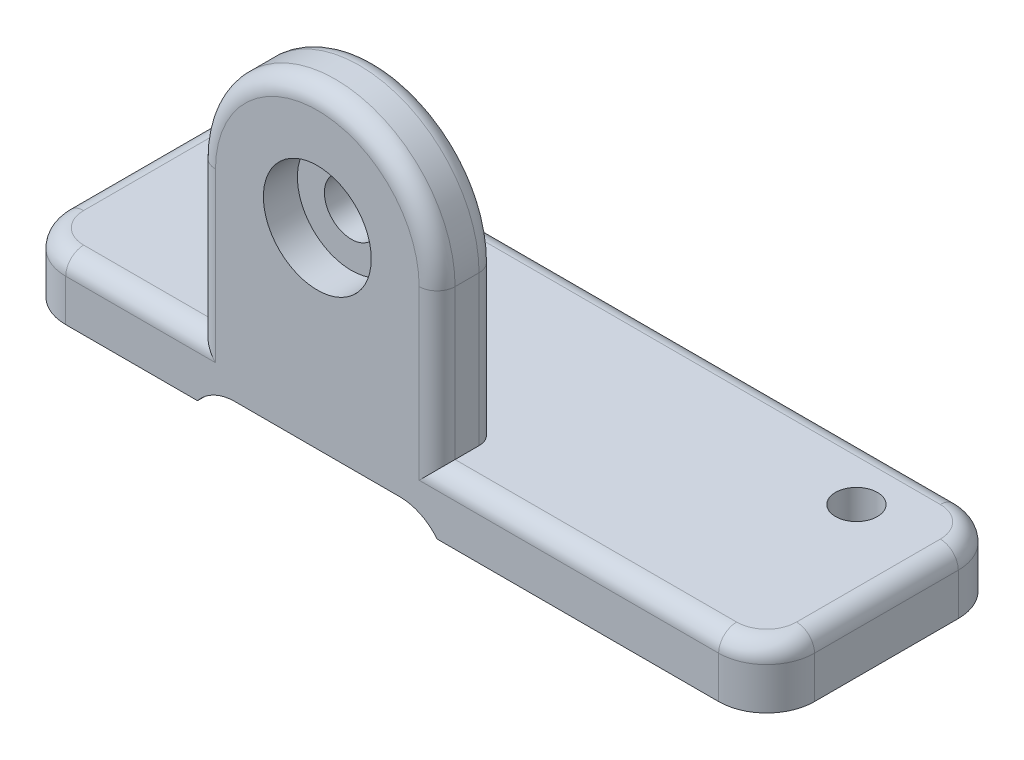
ISO-10303-21;
HEADER;
FILE_DESCRIPTION(('STEP AP214'),'2;1');
FILE_NAME('part.step','',(''),(''),'','','');
FILE_SCHEMA(('AUTOMOTIVE_DESIGN { 1 0 10303 214 1 1 1 1 }'));
ENDSEC;
DATA;
#1=APPLICATION_CONTEXT('core data for automotive mechanical design processes');
#2=APPLICATION_PROTOCOL_DEFINITION('international standard','automotive_design',2000,#1);
#3=PRODUCT_CONTEXT('',#1,'mechanical');
#4=PRODUCT('Part','Part','',(#3));
#5=PRODUCT_RELATED_PRODUCT_CATEGORY('part','',(#4));
#6=PRODUCT_DEFINITION_FORMATION('','',#4);
#7=PRODUCT_DEFINITION_CONTEXT('part definition',#1,'design');
#8=PRODUCT_DEFINITION('design','',#6,#7);
#9=PRODUCT_DEFINITION_SHAPE('','',#8);
#10=(LENGTH_UNIT() NAMED_UNIT(*) SI_UNIT(.MILLI.,.METRE.));
#11=(NAMED_UNIT(*) PLANE_ANGLE_UNIT() SI_UNIT($,.RADIAN.));
#12=(NAMED_UNIT(*) SI_UNIT($,.STERADIAN.) SOLID_ANGLE_UNIT());
#13=UNCERTAINTY_MEASURE_WITH_UNIT(LENGTH_MEASURE(1.E-05),#10,'distance_accuracy_value','');
#14=(GEOMETRIC_REPRESENTATION_CONTEXT(3) GLOBAL_UNCERTAINTY_ASSIGNED_CONTEXT((#13)) GLOBAL_UNIT_ASSIGNED_CONTEXT((#10,
#11,#12)) REPRESENTATION_CONTEXT('',''));
#15=CARTESIAN_POINT('',(0.,0.,0.));
#16=DIRECTION('',(0.,0.,1.));
#17=DIRECTION('',(1.,0.,0.));
#18=AXIS2_PLACEMENT_3D('',#15,#16,#17);
#19=CARTESIAN_POINT('',(0.,0.,0.));
#20=DIRECTION('',(0.,-1.,0.));
#21=DIRECTION('',(0.,0.,-1.));
#22=AXIS2_PLACEMENT_3D('',#19,#20,#21);
#23=PLANE('',#22);
#24=CARTESIAN_POINT('',(15.,0.,-30.));
#25=DIRECTION('',(0.,1.,0.));
#26=DIRECTION('',(0.,0.,1.));
#27=AXIS2_PLACEMENT_3D('',#24,#25,#26);
#28=CIRCLE('',#27,3.5);
#29=CARTESIAN_POINT('',(15.,0.,-26.5));
#30=VERTEX_POINT('',#29);
#31=EDGE_CURVE('E463',#30,#30,#28,.T.);
#32=ORIENTED_EDGE('',*,*,#31,.T.);
#33=EDGE_LOOP('',(#32));
#34=FACE_BOUND('',#33,.T.);
#35=DIRECTION('',(0.,0.,1.));
#36=VECTOR('',#35,1.);
#37=CARTESIAN_POINT('',(0.,0.,0.));
#38=LINE('',#37,#36);
#39=CARTESIAN_POINT('',(0.,0.,-32.));
#40=VERTEX_POINT('',#39);
#41=CARTESIAN_POINT('',(0.,0.,-8.));
#42=VERTEX_POINT('',#41);
#43=EDGE_CURVE('E497',#40,#42,#38,.T.);
#44=ORIENTED_EDGE('',*,*,#43,.F.);
#45=CARTESIAN_POINT('',(8.,0.,-32.));
#46=DIRECTION('',(0.,-1.,0.));
#47=DIRECTION('',(0.,0.,-1.));
#48=AXIS2_PLACEMENT_3D('',#45,#46,#47);
#49=CIRCLE('',#48,8.);
#50=CARTESIAN_POINT('',(8.,0.,-40.));
#51=VERTEX_POINT('',#50);
#52=EDGE_CURVE('E291',#40,#51,#49,.T.);
#53=ORIENTED_EDGE('',*,*,#52,.T.);
#54=DIRECTION('',(-1.,0.,0.));
#55=VECTOR('',#54,1.);
#56=CARTESIAN_POINT('',(0.,0.,-40.));
#57=LINE('',#56,#55);
#58=CARTESIAN_POINT('',(30.,0.,-40.));
#59=VERTEX_POINT('',#58);
#60=EDGE_CURVE('E235',#59,#51,#57,.T.);
#61=ORIENTED_EDGE('',*,*,#60,.F.);
#62=DIRECTION('',(0.,0.,-1.));
#63=VECTOR('',#62,1.);
#64=CARTESIAN_POINT('',(30.,0.,0.));
#65=LINE('',#64,#63);
#66=CARTESIAN_POINT('',(30.,0.,0.));
#67=VERTEX_POINT('',#66);
#68=EDGE_CURVE('E211',#67,#59,#65,.T.);
#69=ORIENTED_EDGE('',*,*,#68,.F.);
#70=DIRECTION('',(1.,0.,0.));
#71=VECTOR('',#70,1.);
#72=CARTESIAN_POINT('',(0.,0.,0.));
#73=LINE('',#72,#71);
#74=CARTESIAN_POINT('',(8.,0.,0.));
#75=VERTEX_POINT('',#74);
#76=EDGE_CURVE('E221',#75,#67,#73,.T.);
#77=ORIENTED_EDGE('',*,*,#76,.F.);
#78=CARTESIAN_POINT('',(8.,0.,-8.));
#79=DIRECTION('',(0.,-1.,0.));
#80=DIRECTION('',(0.,0.,-1.));
#81=AXIS2_PLACEMENT_3D('',#78,#79,#80);
#82=CIRCLE('',#81,8.);
#83=EDGE_CURVE('E288',#75,#42,#82,.T.);
#84=ORIENTED_EDGE('',*,*,#83,.T.);
#85=EDGE_LOOP('',(#44,#53,#61,#69,#77,#84));
#86=FACE_BOUND('',#85,.T.);
#87=ADVANCED_FACE('F41',(#34,#86),#23,.T.);
#88=CARTESIAN_POINT('',(0.,10.,0.));
#89=DIRECTION('',(1.,0.,0.));
#90=DIRECTION('',(0.,0.,-1.));
#91=AXIS2_PLACEMENT_3D('',#88,#89,#90);
#92=PLANE('',#91);
#93=DIRECTION('',(0.,-1.,0.));
#94=VECTOR('',#93,1.);
#95=CARTESIAN_POINT('',(0.,10.,-8.));
#96=LINE('',#95,#94);
#97=CARTESIAN_POINT('',(0.,7.,-8.));
#98=VERTEX_POINT('',#97);
#99=EDGE_CURVE('E281',#42,#98,#96,.F.);
#100=ORIENTED_EDGE('',*,*,#99,.T.);
#101=DIRECTION('',(0.,0.,1.));
#102=VECTOR('',#101,1.);
#103=CARTESIAN_POINT('',(0.,7.,0.));
#104=LINE('',#103,#102);
#105=CARTESIAN_POINT('',(0.,7.,-32.));
#106=VERTEX_POINT('',#105);
#107=EDGE_CURVE('E353',#98,#106,#104,.F.);
#108=ORIENTED_EDGE('',*,*,#107,.T.);
#109=DIRECTION('',(0.,-1.,0.));
#110=VECTOR('',#109,1.);
#111=CARTESIAN_POINT('',(0.,10.,-32.));
#112=LINE('',#111,#110);
#113=EDGE_CURVE('E285',#106,#40,#112,.T.);
#114=ORIENTED_EDGE('',*,*,#113,.T.);
#115=ORIENTED_EDGE('',*,*,#43,.T.);
#116=EDGE_LOOP('',(#100,#108,#114,#115));
#117=FACE_BOUND('',#116,.T.);
#118=ADVANCED_FACE('F602',(#117),#92,.F.);
#119=CARTESIAN_POINT('',(0.,10.,0.));
#120=DIRECTION('',(0.,0.,-1.));
#121=DIRECTION('',(-1.,0.,0.));
#122=AXIS2_PLACEMENT_3D('',#119,#120,#121);
#123=PLANE('',#122);
#124=CARTESIAN_POINT('',(50.,35.,0.));
#125=DIRECTION('',(0.,0.,1.));
#126=DIRECTION('',(1.,0.,0.));
#127=AXIS2_PLACEMENT_3D('',#124,#125,#126);
#128=CIRCLE('',#127,9.005);
#129=CARTESIAN_POINT('',(59.005,35.,0.));
#130=VERTEX_POINT('',#129);
#131=EDGE_CURVE('E444',#130,#130,#128,.T.);
#132=ORIENTED_EDGE('',*,*,#131,.F.);
#133=EDGE_LOOP('',(#132));
#134=FACE_BOUND('',#133,.T.);
#135=DIRECTION('',(0.,-1.,0.));
#136=VECTOR('',#135,1.);
#137=CARTESIAN_POINT('',(33.,10.,0.));
#138=LINE('',#137,#136);
#139=CARTESIAN_POINT('',(33.,35.,0.));
#140=VERTEX_POINT('',#139);
#141=CARTESIAN_POINT('',(33.,7.,0.));
#142=VERTEX_POINT('',#141);
#143=EDGE_CURVE('E344',#140,#142,#138,.T.);
#144=ORIENTED_EDGE('',*,*,#143,.T.);
#145=DIRECTION('',(1.,0.,0.));
#146=VECTOR('',#145,1.);
#147=CARTESIAN_POINT('',(0.,7.,0.));
#148=LINE('',#147,#146);
#149=CARTESIAN_POINT('',(8.,7.,0.));
#150=VERTEX_POINT('',#149);
#151=EDGE_CURVE('E347',#142,#150,#148,.F.);
#152=ORIENTED_EDGE('',*,*,#151,.T.);
#153=DIRECTION('',(0.,-1.,0.));
#154=VECTOR('',#153,1.);
#155=CARTESIAN_POINT('',(8.,10.,0.));
#156=LINE('',#155,#154);
#157=EDGE_CURVE('E225',#150,#75,#156,.T.);
#158=ORIENTED_EDGE('',*,*,#157,.T.);
#159=ORIENTED_EDGE('',*,*,#76,.T.);
#160=CARTESIAN_POINT('',(36.2449979983984,-5.,0.));
#161=DIRECTION('',(0.,0.,-1.));
#162=DIRECTION('',(-1.,0.,0.));
#163=AXIS2_PLACEMENT_3D('',#160,#161,#162);
#164=CIRCLE('',#163,8.);
#165=CARTESIAN_POINT('',(36.2449979983984,3.,0.));
#166=VERTEX_POINT('',#165);
#167=EDGE_CURVE('E206',#67,#166,#164,.T.);
#168=ORIENTED_EDGE('',*,*,#167,.T.);
#169=DIRECTION('',(-1.,0.,0.));
#170=VECTOR('',#169,1.);
#171=CARTESIAN_POINT('',(30.,3.,0.));
#172=LINE('',#171,#170);
#173=CARTESIAN_POINT('',(63.7550020016016,3.,0.));
#174=VERTEX_POINT('',#173);
#175=EDGE_CURVE('E254',#174,#166,#172,.T.);
#176=ORIENTED_EDGE('',*,*,#175,.F.);
#177=CARTESIAN_POINT('',(63.7550020016016,-5.,0.));
#178=DIRECTION('',(0.,0.,-1.));
#179=DIRECTION('',(-1.,0.,0.));
#180=AXIS2_PLACEMENT_3D('',#177,#178,#179);
#181=CIRCLE('',#180,8.);
#182=CARTESIAN_POINT('',(70.,0.,0.));
#183=VERTEX_POINT('',#182);
#184=EDGE_CURVE('E300',#174,#183,#181,.T.);
#185=ORIENTED_EDGE('',*,*,#184,.T.);
#186=CARTESIAN_POINT('',(117.,0.,0.));
#187=VERTEX_POINT('',#186);
#188=EDGE_CURVE('E230',#183,#187,#73,.T.);
#189=ORIENTED_EDGE('',*,*,#188,.T.);
#190=DIRECTION('',(0.,-1.,0.));
#191=VECTOR('',#190,1.);
#192=CARTESIAN_POINT('',(117.,10.,0.));
#193=LINE('',#192,#191);
#194=CARTESIAN_POINT('',(117.,7.,0.));
#195=VERTEX_POINT('',#194);
#196=EDGE_CURVE('E270',#187,#195,#193,.F.);
#197=ORIENTED_EDGE('',*,*,#196,.T.);
#198=DIRECTION('',(1.,0.,0.));
#199=VECTOR('',#198,1.);
#200=CARTESIAN_POINT('',(0.,7.,0.));
#201=LINE('',#200,#199);
#202=CARTESIAN_POINT('',(67.,7.,0.));
#203=VERTEX_POINT('',#202);
#204=EDGE_CURVE('E338',#195,#203,#201,.F.);
#205=ORIENTED_EDGE('',*,*,#204,.T.);
#206=DIRECTION('',(0.,1.,0.));
#207=VECTOR('',#206,1.);
#208=CARTESIAN_POINT('',(67.,35.,0.));
#209=LINE('',#208,#207);
#210=CARTESIAN_POINT('',(67.,35.,0.));
#211=VERTEX_POINT('',#210);
#212=EDGE_CURVE('E335',#203,#211,#209,.T.);
#213=ORIENTED_EDGE('',*,*,#212,.T.);
#214=CARTESIAN_POINT('',(50.,35.,0.));
#215=DIRECTION('',(0.,0.,-1.));
#216=DIRECTION('',(-1.,0.,0.));
#217=AXIS2_PLACEMENT_3D('',#214,#215,#216);
#218=CIRCLE('',#217,17.);
#219=EDGE_CURVE('E341',#211,#140,#218,.F.);
#220=ORIENTED_EDGE('',*,*,#219,.T.);
#221=EDGE_LOOP('',(#144,#152,#158,#159,#168,#176,#185,#189,#197,#205,#213,#220));
#222=FACE_BOUND('',#221,.T.);
#223=ADVANCED_FACE('F222',(#134,#222),#123,.F.);
#224=CARTESIAN_POINT('',(125.,10.,0.));
#225=DIRECTION('',(-1.,0.,0.));
#226=DIRECTION('',(0.,0.,1.));
#227=AXIS2_PLACEMENT_3D('',#224,#225,#226);
#228=PLANE('',#227);
#229=DIRECTION('',(0.,-1.,0.));
#230=VECTOR('',#229,1.);
#231=CARTESIAN_POINT('',(125.,10.,-32.));
#232=LINE('',#231,#230);
#233=CARTESIAN_POINT('',(125.,0.,-32.));
#234=VERTEX_POINT('',#233);
#235=CARTESIAN_POINT('',(125.,7.,-32.));
#236=VERTEX_POINT('',#235);
#237=EDGE_CURVE('E243',#234,#236,#232,.F.);
#238=ORIENTED_EDGE('',*,*,#237,.T.);
#239=DIRECTION('',(0.,0.,-1.));
#240=VECTOR('',#239,1.);
#241=CARTESIAN_POINT('',(125.,7.,0.));
#242=LINE('',#241,#240);
#243=CARTESIAN_POINT('',(125.,7.,-8.));
#244=VERTEX_POINT('',#243);
#245=EDGE_CURVE('E365',#236,#244,#242,.F.);
#246=ORIENTED_EDGE('',*,*,#245,.T.);
#247=DIRECTION('',(0.,-1.,0.));
#248=VECTOR('',#247,1.);
#249=CARTESIAN_POINT('',(125.,10.,-8.));
#250=LINE('',#249,#248);
#251=CARTESIAN_POINT('',(125.,0.,-8.));
#252=VERTEX_POINT('',#251);
#253=EDGE_CURVE('E259',#244,#252,#250,.T.);
#254=ORIENTED_EDGE('',*,*,#253,.T.);
#255=DIRECTION('',(0.,0.,-1.));
#256=VECTOR('',#255,1.);
#257=CARTESIAN_POINT('',(125.,0.,0.));
#258=LINE('',#257,#256);
#259=EDGE_CURVE('E229',#252,#234,#258,.T.);
#260=ORIENTED_EDGE('',*,*,#259,.T.);
#261=EDGE_LOOP('',(#238,#246,#254,#260));
#262=FACE_BOUND('',#261,.T.);
#263=ADVANCED_FACE('F552',(#262),#228,.F.);
#264=CARTESIAN_POINT('',(0.,10.,-40.));
#265=DIRECTION('',(0.,0.,1.));
#266=DIRECTION('',(1.,0.,0.));
#267=AXIS2_PLACEMENT_3D('',#264,#265,#266);
#268=PLANE('',#267);
#269=DIRECTION('',(0.,-1.,0.));
#270=VECTOR('',#269,1.);
#271=CARTESIAN_POINT('',(8.,10.,-40.));
#272=LINE('',#271,#270);
#273=CARTESIAN_POINT('',(8.,7.,-40.));
#274=VERTEX_POINT('',#273);
#275=EDGE_CURVE('E274',#51,#274,#272,.F.);
#276=ORIENTED_EDGE('',*,*,#275,.T.);
#277=DIRECTION('',(-1.,0.,0.));
#278=VECTOR('',#277,1.);
#279=CARTESIAN_POINT('',(0.,7.,-40.));
#280=LINE('',#279,#278);
#281=CARTESIAN_POINT('',(117.,7.,-40.));
#282=VERTEX_POINT('',#281);
#283=EDGE_CURVE('E359',#274,#282,#280,.F.);
#284=ORIENTED_EDGE('',*,*,#283,.T.);
#285=DIRECTION('',(0.,-1.,0.));
#286=VECTOR('',#285,1.);
#287=CARTESIAN_POINT('',(117.,10.,-40.));
#288=LINE('',#287,#286);
#289=CARTESIAN_POINT('',(117.,0.,-40.));
#290=VERTEX_POINT('',#289);
#291=EDGE_CURVE('E278',#282,#290,#288,.T.);
#292=ORIENTED_EDGE('',*,*,#291,.T.);
#293=CARTESIAN_POINT('',(70.,0.,-40.));
#294=VERTEX_POINT('',#293);
#295=EDGE_CURVE('E246',#290,#294,#57,.T.);
#296=ORIENTED_EDGE('',*,*,#295,.T.);
#297=CARTESIAN_POINT('',(63.7550020016016,-5.,-40.));
#298=DIRECTION('',(0.,0.,1.));
#299=DIRECTION('',(1.,0.,0.));
#300=AXIS2_PLACEMENT_3D('',#297,#298,#299);
#301=CIRCLE('',#300,8.);
#302=CARTESIAN_POINT('',(63.7550020016016,3.,-40.));
#303=VERTEX_POINT('',#302);
#304=EDGE_CURVE('E218',#294,#303,#301,.T.);
#305=ORIENTED_EDGE('',*,*,#304,.T.);
#306=DIRECTION('',(-1.,0.,0.));
#307=VECTOR('',#306,1.);
#308=CARTESIAN_POINT('',(0.,3.,-40.));
#309=LINE('',#308,#307);
#310=CARTESIAN_POINT('',(36.2449979983984,3.,-40.));
#311=VERTEX_POINT('',#310);
#312=EDGE_CURVE('E237',#303,#311,#309,.T.);
#313=ORIENTED_EDGE('',*,*,#312,.T.);
#314=CARTESIAN_POINT('',(36.2449979983984,-5.,-40.));
#315=DIRECTION('',(0.,0.,1.));
#316=DIRECTION('',(1.,0.,0.));
#317=AXIS2_PLACEMENT_3D('',#314,#315,#316);
#318=CIRCLE('',#317,8.);
#319=EDGE_CURVE('E217',#311,#59,#318,.T.);
#320=ORIENTED_EDGE('',*,*,#319,.T.);
#321=ORIENTED_EDGE('',*,*,#60,.T.);
#322=EDGE_LOOP('',(#276,#284,#292,#296,#305,#313,#320,#321));
#323=FACE_BOUND('',#322,.T.);
#324=ADVANCED_FACE('F509',(#323),#268,.F.);
#325=CARTESIAN_POINT('',(0.,10.,0.));
#326=DIRECTION('',(0.,-1.,0.));
#327=DIRECTION('',(0.,0.,-1.));
#328=AXIS2_PLACEMENT_3D('',#325,#326,#327);
#329=PLANE('',#328);
#330=CARTESIAN_POINT('',(15.,10.,-30.));
#331=DIRECTION('',(0.,1.,0.));
#332=DIRECTION('',(0.,0.,1.));
#333=AXIS2_PLACEMENT_3D('',#330,#331,#332);
#334=CIRCLE('',#333,3.5);
#335=CARTESIAN_POINT('',(15.,10.,-26.5));
#336=VERTEX_POINT('',#335);
#337=EDGE_CURVE('E961',#336,#336,#334,.T.);
#338=ORIENTED_EDGE('',*,*,#337,.F.);
#339=EDGE_LOOP('',(#338));
#340=FACE_BOUND('',#339,.T.);
#341=CARTESIAN_POINT('',(110.,10.,-30.));
#342=DIRECTION('',(0.,1.,0.));
#343=DIRECTION('',(0.,0.,1.));
#344=AXIS2_PLACEMENT_3D('',#341,#342,#343);
#345=CIRCLE('',#344,3.5);
#346=CARTESIAN_POINT('',(110.,10.,-26.5));
#347=VERTEX_POINT('',#346);
#348=EDGE_CURVE('E457',#347,#347,#345,.T.);
#349=ORIENTED_EDGE('',*,*,#348,.F.);
#350=EDGE_LOOP('',(#349));
#351=FACE_BOUND('',#350,.T.);
#352=CARTESIAN_POINT('',(8.,10.,-8.));
#353=DIRECTION('',(0.,-1.,0.));
#354=DIRECTION('',(0.,0.,-1.));
#355=AXIS2_PLACEMENT_3D('',#352,#353,#354);
#356=CIRCLE('',#355,5.);
#357=CARTESIAN_POINT('',(3.,10.,-8.));
#358=VERTEX_POINT('',#357);
#359=CARTESIAN_POINT('',(8.,10.,-3.));
#360=VERTEX_POINT('',#359);
#361=EDGE_CURVE('E328',#358,#360,#356,.F.);
#362=ORIENTED_EDGE('',*,*,#361,.T.);
#363=DIRECTION('',(1.,0.,0.));
#364=VECTOR('',#363,1.);
#365=CARTESIAN_POINT('',(0.,10.,-3.));
#366=LINE('',#365,#364);
#367=CARTESIAN_POINT('',(30.,10.,-3.));
#368=VERTEX_POINT('',#367);
#369=EDGE_CURVE('E331',#360,#368,#366,.T.);
#370=ORIENTED_EDGE('',*,*,#369,.T.);
#371=DIRECTION('',(0.,0.,-1.));
#372=VECTOR('',#371,1.);
#373=CARTESIAN_POINT('',(30.,10.,0.));
#374=LINE('',#373,#372);
#375=CARTESIAN_POINT('',(30.,10.,-7.));
#376=VERTEX_POINT('',#375);
#377=EDGE_CURVE('E489',#368,#376,#374,.T.);
#378=ORIENTED_EDGE('',*,*,#377,.T.);
#379=CARTESIAN_POINT('',(33.,10.,-7.));
#380=DIRECTION('',(0.,-1.,0.));
#381=DIRECTION('',(0.,0.,-1.));
#382=AXIS2_PLACEMENT_3D('',#379,#380,#381);
#383=CIRCLE('',#382,3.);
#384=CARTESIAN_POINT('',(33.,10.,-10.));
#385=VERTEX_POINT('',#384);
#386=EDGE_CURVE('E51',#376,#385,#383,.T.);
#387=ORIENTED_EDGE('',*,*,#386,.T.);
#388=DIRECTION('',(-1.,0.,0.));
#389=VECTOR('',#388,1.);
#390=CARTESIAN_POINT('',(0.,10.,-10.));
#391=LINE('',#390,#389);
#392=CARTESIAN_POINT('',(67.,10.,-10.));
#393=VERTEX_POINT('',#392);
#394=EDGE_CURVE('E483',#393,#385,#391,.T.);
#395=ORIENTED_EDGE('',*,*,#394,.F.);
#396=CARTESIAN_POINT('',(67.,10.,-7.));
#397=DIRECTION('',(0.,-1.,0.));
#398=DIRECTION('',(0.,0.,-1.));
#399=AXIS2_PLACEMENT_3D('',#396,#397,#398);
#400=CIRCLE('',#399,3.);
#401=CARTESIAN_POINT('',(70.,10.,-7.));
#402=VERTEX_POINT('',#401);
#403=EDGE_CURVE('E11',#393,#402,#400,.T.);
#404=ORIENTED_EDGE('',*,*,#403,.T.);
#405=DIRECTION('',(0.,0.,1.));
#406=VECTOR('',#405,1.);
#407=CARTESIAN_POINT('',(70.,10.,0.));
#408=LINE('',#407,#406);
#409=CARTESIAN_POINT('',(70.,10.,-3.));
#410=VERTEX_POINT('',#409);
#411=EDGE_CURVE('E493',#402,#410,#408,.T.);
#412=ORIENTED_EDGE('',*,*,#411,.T.);
#413=DIRECTION('',(1.,0.,0.));
#414=VECTOR('',#413,1.);
#415=CARTESIAN_POINT('',(0.,10.,-3.));
#416=LINE('',#415,#414);
#417=CARTESIAN_POINT('',(117.,10.,-3.));
#418=VERTEX_POINT('',#417);
#419=EDGE_CURVE('E307',#410,#418,#416,.T.);
#420=ORIENTED_EDGE('',*,*,#419,.T.);
#421=CARTESIAN_POINT('',(117.,10.,-8.));
#422=DIRECTION('',(0.,-1.,0.));
#423=DIRECTION('',(0.,0.,-1.));
#424=AXIS2_PLACEMENT_3D('',#421,#422,#423);
#425=CIRCLE('',#424,5.);
#426=CARTESIAN_POINT('',(122.,10.,-8.));
#427=VERTEX_POINT('',#426);
#428=EDGE_CURVE('E310',#418,#427,#425,.F.);
#429=ORIENTED_EDGE('',*,*,#428,.T.);
#430=DIRECTION('',(0.,0.,-1.));
#431=VECTOR('',#430,1.);
#432=CARTESIAN_POINT('',(122.,10.,0.));
#433=LINE('',#432,#431);
#434=CARTESIAN_POINT('',(122.,10.,-32.));
#435=VERTEX_POINT('',#434);
#436=EDGE_CURVE('E313',#427,#435,#433,.T.);
#437=ORIENTED_EDGE('',*,*,#436,.T.);
#438=CARTESIAN_POINT('',(117.,10.,-32.));
#439=DIRECTION('',(0.,-1.,0.));
#440=DIRECTION('',(0.,0.,-1.));
#441=AXIS2_PLACEMENT_3D('',#438,#439,#440);
#442=CIRCLE('',#441,5.);
#443=CARTESIAN_POINT('',(117.,10.,-37.));
#444=VERTEX_POINT('',#443);
#445=EDGE_CURVE('E316',#435,#444,#442,.F.);
#446=ORIENTED_EDGE('',*,*,#445,.T.);
#447=DIRECTION('',(-1.,0.,0.));
#448=VECTOR('',#447,1.);
#449=CARTESIAN_POINT('',(0.,10.,-37.));
#450=LINE('',#449,#448);
#451=CARTESIAN_POINT('',(8.,10.,-37.));
#452=VERTEX_POINT('',#451);
#453=EDGE_CURVE('E319',#444,#452,#450,.T.);
#454=ORIENTED_EDGE('',*,*,#453,.T.);
#455=CARTESIAN_POINT('',(8.,10.,-32.));
#456=DIRECTION('',(0.,-1.,0.));
#457=DIRECTION('',(0.,0.,-1.));
#458=AXIS2_PLACEMENT_3D('',#455,#456,#457);
#459=CIRCLE('',#458,5.);
#460=CARTESIAN_POINT('',(3.,10.,-32.));
#461=VERTEX_POINT('',#460);
#462=EDGE_CURVE('E322',#452,#461,#459,.F.);
#463=ORIENTED_EDGE('',*,*,#462,.T.);
#464=DIRECTION('',(0.,0.,1.));
#465=VECTOR('',#464,1.);
#466=CARTESIAN_POINT('',(3.,10.,0.));
#467=LINE('',#466,#465);
#468=EDGE_CURVE('E325',#461,#358,#467,.T.);
#469=ORIENTED_EDGE('',*,*,#468,.T.);
#470=EDGE_LOOP('',(#362,#370,#378,#387,#395,#404,#412,#420,#429,#437,#446,#454,#463,#469));
#471=FACE_BOUND('',#470,.T.);
#472=ADVANCED_FACE('F528',(#340,#351,#471),#329,.F.);
#473=CARTESIAN_POINT('',(110.,0.,-30.));
#474=DIRECTION('',(0.,1.,0.));
#475=DIRECTION('',(0.,0.,1.));
#476=AXIS2_PLACEMENT_3D('',#473,#474,#475);
#477=CIRCLE('',#476,3.5);
#478=CARTESIAN_POINT('',(110.,0.,-26.5));
#479=VERTEX_POINT('',#478);
#480=EDGE_CURVE('E448',#479,#479,#477,.T.);
#481=ORIENTED_EDGE('',*,*,#480,.T.);
#482=EDGE_LOOP('',(#481));
#483=FACE_BOUND('',#482,.T.);
#484=ORIENTED_EDGE('',*,*,#259,.F.);
#485=CARTESIAN_POINT('',(117.,0.,-8.));
#486=DIRECTION('',(0.,-1.,0.));
#487=DIRECTION('',(0.,0.,-1.));
#488=AXIS2_PLACEMENT_3D('',#485,#486,#487);
#489=CIRCLE('',#488,8.);
#490=EDGE_CURVE('E265',#252,#187,#489,.T.);
#491=ORIENTED_EDGE('',*,*,#490,.T.);
#492=ORIENTED_EDGE('',*,*,#188,.F.);
#493=DIRECTION('',(0.,0.,1.));
#494=VECTOR('',#493,1.);
#495=CARTESIAN_POINT('',(70.,0.,0.));
#496=LINE('',#495,#494);
#497=EDGE_CURVE('E238',#294,#183,#496,.T.);
#498=ORIENTED_EDGE('',*,*,#497,.F.);
#499=ORIENTED_EDGE('',*,*,#295,.F.);
#500=CARTESIAN_POINT('',(117.,0.,-32.));
#501=DIRECTION('',(0.,-1.,0.));
#502=DIRECTION('',(0.,0.,-1.));
#503=AXIS2_PLACEMENT_3D('',#500,#501,#502);
#504=CIRCLE('',#503,8.);
#505=EDGE_CURVE('E262',#290,#234,#504,.T.);
#506=ORIENTED_EDGE('',*,*,#505,.T.);
#507=EDGE_LOOP('',(#484,#491,#492,#498,#499,#506));
#508=FACE_BOUND('',#507,.T.);
#509=ADVANCED_FACE('F561',(#483,#508),#23,.T.);
#510=CARTESIAN_POINT('',(70.,0.,-10.));
#511=DIRECTION('',(1.,0.,0.));
#512=DIRECTION('',(0.,0.,-1.));
#513=AXIS2_PLACEMENT_3D('',#510,#511,#512);
#514=PLANE('',#513);
#515=ORIENTED_EDGE('',*,*,#411,.F.);
#516=DIRECTION('',(0.,1.,0.));
#517=VECTOR('',#516,1.);
#518=CARTESIAN_POINT('',(70.,35.,-7.));
#519=LINE('',#518,#517);
#520=CARTESIAN_POINT('',(70.,35.,-7.));
#521=VERTEX_POINT('',#520);
#522=EDGE_CURVE('E66',#402,#521,#519,.T.);
#523=ORIENTED_EDGE('',*,*,#522,.T.);
#524=DIRECTION('',(0.,0.,1.));
#525=VECTOR('',#524,1.);
#526=CARTESIAN_POINT('',(70.,35.,-10.));
#527=LINE('',#526,#525);
#528=CARTESIAN_POINT('',(70.,35.,-3.));
#529=VERTEX_POINT('',#528);
#530=EDGE_CURVE('E480',#521,#529,#527,.T.);
#531=ORIENTED_EDGE('',*,*,#530,.T.);
#532=DIRECTION('',(0.,1.,0.));
#533=VECTOR('',#532,1.);
#534=CARTESIAN_POINT('',(70.,10.,-3.));
#535=LINE('',#534,#533);
#536=EDGE_CURVE('E392',#529,#410,#535,.F.);
#537=ORIENTED_EDGE('',*,*,#536,.T.);
#538=EDGE_LOOP('',(#515,#523,#531,#537));
#539=FACE_BOUND('',#538,.T.);
#540=ADVANCED_FACE('F677',(#539),#514,.T.);
#541=CARTESIAN_POINT('',(30.,35.,-10.));
#542=DIRECTION('',(-1.,0.,0.));
#543=DIRECTION('',(0.,0.,1.));
#544=AXIS2_PLACEMENT_3D('',#541,#542,#543);
#545=PLANE('',#544);
#546=DIRECTION('',(0.,0.,1.));
#547=VECTOR('',#546,1.);
#548=CARTESIAN_POINT('',(30.,35.,-10.));
#549=LINE('',#548,#547);
#550=CARTESIAN_POINT('',(30.,35.,-7.));
#551=VERTEX_POINT('',#550);
#552=CARTESIAN_POINT('',(30.,35.,-3.));
#553=VERTEX_POINT('',#552);
#554=EDGE_CURVE('E479',#551,#553,#549,.T.);
#555=ORIENTED_EDGE('',*,*,#554,.F.);
#556=DIRECTION('',(0.,-1.,0.));
#557=VECTOR('',#556,1.);
#558=CARTESIAN_POINT('',(30.,10.,-7.));
#559=LINE('',#558,#557);
#560=EDGE_CURVE('E374',#551,#376,#559,.T.);
#561=ORIENTED_EDGE('',*,*,#560,.T.);
#562=ORIENTED_EDGE('',*,*,#377,.F.);
#563=DIRECTION('',(0.,-1.,0.));
#564=VECTOR('',#563,1.);
#565=CARTESIAN_POINT('',(30.,35.,-3.));
#566=LINE('',#565,#564);
#567=EDGE_CURVE('E371',#368,#553,#566,.F.);
#568=ORIENTED_EDGE('',*,*,#567,.T.);
#569=EDGE_LOOP('',(#555,#561,#562,#568));
#570=FACE_BOUND('',#569,.T.);
#571=ADVANCED_FACE('F675',(#570),#545,.T.);
#572=CARTESIAN_POINT('',(50.,35.,-10.));
#573=DIRECTION('',(0.,0.,1.));
#574=DIRECTION('',(1.,0.,0.));
#575=AXIS2_PLACEMENT_3D('',#572,#573,#574);
#576=PLANE('',#575);
#577=CARTESIAN_POINT('',(50.,35.,-10.));
#578=DIRECTION('',(0.,0.,1.));
#579=DIRECTION('',(1.,0.,0.));
#580=AXIS2_PLACEMENT_3D('',#577,#578,#579);
#581=CIRCLE('',#580,4.49999999999999);
#582=CARTESIAN_POINT('',(54.5,35.,-10.));
#583=VERTEX_POINT('',#582);
#584=EDGE_CURVE('E250',#583,#583,#581,.T.);
#585=ORIENTED_EDGE('',*,*,#584,.T.);
#586=EDGE_LOOP('',(#585));
#587=FACE_BOUND('',#586,.T.);
#588=ORIENTED_EDGE('',*,*,#394,.T.);
#589=DIRECTION('',(0.,-1.,0.));
#590=VECTOR('',#589,1.);
#591=CARTESIAN_POINT('',(33.,35.,-10.));
#592=LINE('',#591,#590);
#593=CARTESIAN_POINT('',(33.,35.,-10.));
#594=VERTEX_POINT('',#593);
#595=EDGE_CURVE('E384',#385,#594,#592,.F.);
#596=ORIENTED_EDGE('',*,*,#595,.T.);
#597=CARTESIAN_POINT('',(50.,35.,-10.));
#598=DIRECTION('',(0.,0.,1.));
#599=DIRECTION('',(1.,0.,0.));
#600=AXIS2_PLACEMENT_3D('',#597,#598,#599);
#601=CIRCLE('',#600,17.);
#602=CARTESIAN_POINT('',(67.,35.,-10.));
#603=VERTEX_POINT('',#602);
#604=EDGE_CURVE('E381',#594,#603,#601,.F.);
#605=ORIENTED_EDGE('',*,*,#604,.T.);
#606=DIRECTION('',(0.,1.,0.));
#607=VECTOR('',#606,1.);
#608=CARTESIAN_POINT('',(67.,10.,-10.));
#609=LINE('',#608,#607);
#610=EDGE_CURVE('E378',#603,#393,#609,.F.);
#611=ORIENTED_EDGE('',*,*,#610,.T.);
#612=EDGE_LOOP('',(#588,#596,#605,#611));
#613=FACE_BOUND('',#612,.T.);
#614=ADVANCED_FACE('F671',(#587,#613),#576,.F.);
#615=CARTESIAN_POINT('',(50.,35.,-10.));
#616=DIRECTION('',(0.,0.,1.));
#617=DIRECTION('',(1.,0.,0.));
#618=AXIS2_PLACEMENT_3D('',#615,#616,#617);
#619=CYLINDRICAL_SURFACE('',#618,20.);
#620=ORIENTED_EDGE('',*,*,#530,.F.);
#621=CARTESIAN_POINT('',(50.,35.,-7.));
#622=DIRECTION('',(0.,0.,1.));
#623=DIRECTION('',(1.,0.,0.));
#624=AXIS2_PLACEMENT_3D('',#621,#622,#623);
#625=CIRCLE('',#624,20.);
#626=EDGE_CURVE('E389',#521,#551,#625,.T.);
#627=ORIENTED_EDGE('',*,*,#626,.T.);
#628=ORIENTED_EDGE('',*,*,#554,.T.);
#629=CARTESIAN_POINT('',(50.,35.,-3.));
#630=DIRECTION('',(0.,0.,-1.));
#631=DIRECTION('',(-1.,0.,0.));
#632=AXIS2_PLACEMENT_3D('',#629,#630,#631);
#633=CIRCLE('',#632,20.);
#634=EDGE_CURVE('E59',#553,#529,#633,.T.);
#635=ORIENTED_EDGE('',*,*,#634,.T.);
#636=EDGE_LOOP('',(#620,#627,#628,#635));
#637=FACE_BOUND('',#636,.T.);
#638=ADVANCED_FACE('F676',(#637),#619,.T.);
#639=CARTESIAN_POINT('',(30.,3.,-80.));
#640=DIRECTION('',(0.,1.,0.));
#641=DIRECTION('',(0.,0.,1.));
#642=AXIS2_PLACEMENT_3D('',#639,#640,#641);
#643=PLANE('',#642);
#644=ORIENTED_EDGE('',*,*,#312,.F.);
#645=DIRECTION('',(0.,0.,-1.));
#646=VECTOR('',#645,1.);
#647=CARTESIAN_POINT('',(63.7550020016016,3.,-80.));
#648=LINE('',#647,#646);
#649=EDGE_CURVE('E296',#303,#174,#648,.F.);
#650=ORIENTED_EDGE('',*,*,#649,.T.);
#651=ORIENTED_EDGE('',*,*,#175,.T.);
#652=DIRECTION('',(0.,0.,1.));
#653=VECTOR('',#652,1.);
#654=CARTESIAN_POINT('',(36.2449979983984,3.,-80.));
#655=LINE('',#654,#653);
#656=EDGE_CURVE('E212',#166,#311,#655,.F.);
#657=ORIENTED_EDGE('',*,*,#656,.T.);
#658=EDGE_LOOP('',(#644,#650,#651,#657));
#659=FACE_BOUND('',#658,.T.);
#660=ADVANCED_FACE('F568',(#659),#643,.F.);
#661=CARTESIAN_POINT('',(50.,35.,0.));
#662=DIRECTION('',(0.,0.,1.));
#663=DIRECTION('',(1.,0.,0.));
#664=AXIS2_PLACEMENT_3D('',#661,#662,#663);
#665=CYLINDRICAL_SURFACE('',#664,4.49999999999999);
#666=CARTESIAN_POINT('',(50.,35.,-5.68));
#667=DIRECTION('',(0.,0.,1.));
#668=DIRECTION('',(1.,0.,0.));
#669=AXIS2_PLACEMENT_3D('',#666,#667,#668);
#670=CIRCLE('',#669,4.5);
#671=CARTESIAN_POINT('',(54.5,35.,-5.68));
#672=VERTEX_POINT('',#671);
#673=EDGE_CURVE('E255',#672,#672,#670,.T.);
#674=ORIENTED_EDGE('',*,*,#673,.T.);
#675=EDGE_LOOP('',(#674));
#676=FACE_BOUND('',#675,.T.);
#677=ORIENTED_EDGE('',*,*,#584,.F.);
#678=EDGE_LOOP('',(#677));
#679=FACE_BOUND('',#678,.T.);
#680=ADVANCED_FACE('F746',(#676,#679),#665,.F.);
#681=CARTESIAN_POINT('',(54.5,35.,-5.68));
#682=DIRECTION('',(0.,0.,-1.));
#683=DIRECTION('',(-1.,0.,0.));
#684=AXIS2_PLACEMENT_3D('',#681,#682,#683);
#685=PLANE('',#684);
#686=ORIENTED_EDGE('',*,*,#673,.F.);
#687=EDGE_LOOP('',(#686));
#688=FACE_BOUND('',#687,.T.);
#689=CARTESIAN_POINT('',(50.,35.,-5.68));
#690=DIRECTION('',(0.,0.,1.));
#691=DIRECTION('',(1.,0.,0.));
#692=AXIS2_PLACEMENT_3D('',#689,#690,#691);
#693=CIRCLE('',#692,9.005);
#694=CARTESIAN_POINT('',(59.005,35.,-5.68));
#695=VERTEX_POINT('',#694);
#696=EDGE_CURVE('E470',#695,#695,#693,.T.);
#697=ORIENTED_EDGE('',*,*,#696,.T.);
#698=EDGE_LOOP('',(#697));
#699=FACE_BOUND('',#698,.T.);
#700=ADVANCED_FACE('F742',(#688,#699),#685,.F.);
#701=CARTESIAN_POINT('',(50.,35.,0.));
#702=DIRECTION('',(0.,0.,1.));
#703=DIRECTION('',(1.,0.,0.));
#704=AXIS2_PLACEMENT_3D('',#701,#702,#703);
#705=CYLINDRICAL_SURFACE('',#704,9.005);
#706=ORIENTED_EDGE('',*,*,#696,.F.);
#707=EDGE_LOOP('',(#706));
#708=FACE_BOUND('',#707,.T.);
#709=ORIENTED_EDGE('',*,*,#131,.T.);
#710=EDGE_LOOP('',(#709));
#711=FACE_BOUND('',#710,.T.);
#712=ADVANCED_FACE('F617',(#708,#711),#705,.F.);
#713=CARTESIAN_POINT('',(117.,10.,-8.));
#714=DIRECTION('',(0.,-1.,0.));
#715=DIRECTION('',(0.,0.,-1.));
#716=AXIS2_PLACEMENT_3D('',#713,#714,#715);
#717=CYLINDRICAL_SURFACE('',#716,8.);
#718=ORIENTED_EDGE('',*,*,#253,.F.);
#719=CARTESIAN_POINT('',(117.,7.,-8.));
#720=DIRECTION('',(0.,-1.,0.));
#721=DIRECTION('',(0.,0.,-1.));
#722=AXIS2_PLACEMENT_3D('',#719,#720,#721);
#723=CIRCLE('',#722,8.);
#724=EDGE_CURVE('E368',#244,#195,#723,.T.);
#725=ORIENTED_EDGE('',*,*,#724,.T.);
#726=ORIENTED_EDGE('',*,*,#196,.F.);
#727=ORIENTED_EDGE('',*,*,#490,.F.);
#728=EDGE_LOOP('',(#718,#725,#726,#727));
#729=FACE_BOUND('',#728,.T.);
#730=ADVANCED_FACE('F555',(#729),#717,.T.);
#731=CARTESIAN_POINT('',(117.,10.,-32.));
#732=DIRECTION('',(0.,-1.,0.));
#733=DIRECTION('',(0.,0.,-1.));
#734=AXIS2_PLACEMENT_3D('',#731,#732,#733);
#735=CYLINDRICAL_SURFACE('',#734,8.);
#736=ORIENTED_EDGE('',*,*,#291,.F.);
#737=CARTESIAN_POINT('',(117.,7.,-32.));
#738=DIRECTION('',(0.,-1.,0.));
#739=DIRECTION('',(0.,0.,-1.));
#740=AXIS2_PLACEMENT_3D('',#737,#738,#739);
#741=CIRCLE('',#740,8.);
#742=EDGE_CURVE('E362',#282,#236,#741,.T.);
#743=ORIENTED_EDGE('',*,*,#742,.T.);
#744=ORIENTED_EDGE('',*,*,#237,.F.);
#745=ORIENTED_EDGE('',*,*,#505,.F.);
#746=EDGE_LOOP('',(#736,#743,#744,#745));
#747=FACE_BOUND('',#746,.T.);
#748=ADVANCED_FACE('F539',(#747),#735,.T.);
#749=CARTESIAN_POINT('',(8.,10.,-32.));
#750=DIRECTION('',(0.,-1.,0.));
#751=DIRECTION('',(0.,0.,-1.));
#752=AXIS2_PLACEMENT_3D('',#749,#750,#751);
#753=CYLINDRICAL_SURFACE('',#752,8.);
#754=ORIENTED_EDGE('',*,*,#113,.F.);
#755=CARTESIAN_POINT('',(8.,7.,-32.));
#756=DIRECTION('',(0.,-1.,0.));
#757=DIRECTION('',(0.,0.,-1.));
#758=AXIS2_PLACEMENT_3D('',#755,#756,#757);
#759=CIRCLE('',#758,8.);
#760=EDGE_CURVE('E356',#106,#274,#759,.T.);
#761=ORIENTED_EDGE('',*,*,#760,.T.);
#762=ORIENTED_EDGE('',*,*,#275,.F.);
#763=ORIENTED_EDGE('',*,*,#52,.F.);
#764=EDGE_LOOP('',(#754,#761,#762,#763));
#765=FACE_BOUND('',#764,.T.);
#766=ADVANCED_FACE('F514',(#765),#753,.T.);
#767=CARTESIAN_POINT('',(8.,10.,-8.));
#768=DIRECTION('',(0.,-1.,0.));
#769=DIRECTION('',(0.,0.,-1.));
#770=AXIS2_PLACEMENT_3D('',#767,#768,#769);
#771=CYLINDRICAL_SURFACE('',#770,8.);
#772=ORIENTED_EDGE('',*,*,#157,.F.);
#773=CARTESIAN_POINT('',(8.,7.,-8.));
#774=DIRECTION('',(0.,-1.,0.));
#775=DIRECTION('',(0.,0.,-1.));
#776=AXIS2_PLACEMENT_3D('',#773,#774,#775);
#777=CIRCLE('',#776,8.);
#778=EDGE_CURVE('E350',#150,#98,#777,.T.);
#779=ORIENTED_EDGE('',*,*,#778,.T.);
#780=ORIENTED_EDGE('',*,*,#99,.F.);
#781=ORIENTED_EDGE('',*,*,#83,.F.);
#782=EDGE_LOOP('',(#772,#779,#780,#781));
#783=FACE_BOUND('',#782,.T.);
#784=ADVANCED_FACE('F599',(#783),#771,.T.);
#785=CARTESIAN_POINT('',(63.7550020016016,-5.,-80.));
#786=DIRECTION('',(0.,0.,-1.));
#787=DIRECTION('',(-1.,0.,0.));
#788=AXIS2_PLACEMENT_3D('',#785,#786,#787);
#789=CYLINDRICAL_SURFACE('',#788,8.);
#790=ORIENTED_EDGE('',*,*,#304,.F.);
#791=ORIENTED_EDGE('',*,*,#497,.T.);
#792=ORIENTED_EDGE('',*,*,#184,.F.);
#793=ORIENTED_EDGE('',*,*,#649,.F.);
#794=EDGE_LOOP('',(#790,#791,#792,#793));
#795=FACE_BOUND('',#794,.T.);
#796=ADVANCED_FACE('F565',(#795),#789,.F.);
#797=CARTESIAN_POINT('',(36.2449979983984,-5.,-80.));
#798=DIRECTION('',(0.,0.,1.));
#799=DIRECTION('',(1.,0.,0.));
#800=AXIS2_PLACEMENT_3D('',#797,#798,#799);
#801=CYLINDRICAL_SURFACE('',#800,8.);
#802=ORIENTED_EDGE('',*,*,#319,.F.);
#803=ORIENTED_EDGE('',*,*,#656,.F.);
#804=ORIENTED_EDGE('',*,*,#167,.F.);
#805=ORIENTED_EDGE('',*,*,#68,.T.);
#806=EDGE_LOOP('',(#802,#803,#804,#805));
#807=FACE_BOUND('',#806,.T.);
#808=ADVANCED_FACE('F209',(#807),#801,.F.);
#809=CARTESIAN_POINT('',(122.,7.,0.));
#810=DIRECTION('',(0.,0.,-1.));
#811=DIRECTION('',(-1.,0.,0.));
#812=AXIS2_PLACEMENT_3D('',#809,#810,#811);
#813=CYLINDRICAL_SURFACE('',#812,3.);
#814=CARTESIAN_POINT('',(122.,7.,-8.));
#815=DIRECTION('',(0.,0.,1.));
#816=DIRECTION('',(1.,0.,0.));
#817=AXIS2_PLACEMENT_3D('',#814,#815,#816);
#818=CIRCLE('',#817,3.);
#819=EDGE_CURVE('E437',#244,#427,#818,.T.);
#820=ORIENTED_EDGE('',*,*,#819,.F.);
#821=ORIENTED_EDGE('',*,*,#245,.F.);
#822=CARTESIAN_POINT('',(122.,7.,-32.));
#823=DIRECTION('',(0.,0.,-1.));
#824=DIRECTION('',(-1.,0.,0.));
#825=AXIS2_PLACEMENT_3D('',#822,#823,#824);
#826=CIRCLE('',#825,3.);
#827=EDGE_CURVE('E441',#435,#236,#826,.T.);
#828=ORIENTED_EDGE('',*,*,#827,.F.);
#829=ORIENTED_EDGE('',*,*,#436,.F.);
#830=EDGE_LOOP('',(#820,#821,#828,#829));
#831=FACE_BOUND('',#830,.T.);
#832=ADVANCED_FACE('F548',(#831),#813,.T.);
#833=CARTESIAN_POINT('',(117.,7.,-32.));
#834=DIRECTION('',(0.,-1.,0.));
#835=DIRECTION('',(0.,0.,-1.));
#836=AXIS2_PLACEMENT_3D('',#833,#834,#835);
#837=TOROIDAL_SURFACE('',#836,5.,3.);
#838=ORIENTED_EDGE('',*,*,#827,.T.);
#839=ORIENTED_EDGE('',*,*,#742,.F.);
#840=CARTESIAN_POINT('',(117.,7.,-37.));
#841=DIRECTION('',(-1.,0.,0.));
#842=DIRECTION('',(0.,0.,1.));
#843=AXIS2_PLACEMENT_3D('',#840,#841,#842);
#844=CIRCLE('',#843,3.);
#845=EDGE_CURVE('E433',#444,#282,#844,.T.);
#846=ORIENTED_EDGE('',*,*,#845,.F.);
#847=ORIENTED_EDGE('',*,*,#445,.F.);
#848=EDGE_LOOP('',(#838,#839,#846,#847));
#849=FACE_BOUND('',#848,.T.);
#850=ADVANCED_FACE('F542',(#849),#837,.T.);
#851=CARTESIAN_POINT('',(117.,7.,-8.));
#852=DIRECTION('',(0.,-1.,0.));
#853=DIRECTION('',(0.,0.,-1.));
#854=AXIS2_PLACEMENT_3D('',#851,#852,#853);
#855=TOROIDAL_SURFACE('',#854,5.,3.);
#856=ORIENTED_EDGE('',*,*,#819,.T.);
#857=ORIENTED_EDGE('',*,*,#428,.F.);
#858=CARTESIAN_POINT('',(117.,7.,-3.));
#859=DIRECTION('',(-1.,0.,0.));
#860=DIRECTION('',(0.,0.,1.));
#861=AXIS2_PLACEMENT_3D('',#858,#859,#860);
#862=CIRCLE('',#861,3.);
#863=EDGE_CURVE('E429',#195,#418,#862,.T.);
#864=ORIENTED_EDGE('',*,*,#863,.F.);
#865=ORIENTED_EDGE('',*,*,#724,.F.);
#866=EDGE_LOOP('',(#856,#857,#864,#865));
#867=FACE_BOUND('',#866,.T.);
#868=ADVANCED_FACE('F575',(#867),#855,.T.);
#869=CARTESIAN_POINT('',(0.,7.,-37.));
#870=DIRECTION('',(-1.,0.,0.));
#871=DIRECTION('',(0.,0.,1.));
#872=AXIS2_PLACEMENT_3D('',#869,#870,#871);
#873=CYLINDRICAL_SURFACE('',#872,3.);
#874=ORIENTED_EDGE('',*,*,#845,.T.);
#875=ORIENTED_EDGE('',*,*,#283,.F.);
#876=CARTESIAN_POINT('',(8.,7.,-37.));
#877=DIRECTION('',(-1.,0.,0.));
#878=DIRECTION('',(0.,0.,1.));
#879=AXIS2_PLACEMENT_3D('',#876,#877,#878);
#880=CIRCLE('',#879,3.);
#881=EDGE_CURVE('E425',#452,#274,#880,.T.);
#882=ORIENTED_EDGE('',*,*,#881,.F.);
#883=ORIENTED_EDGE('',*,*,#453,.F.);
#884=EDGE_LOOP('',(#874,#875,#882,#883));
#885=FACE_BOUND('',#884,.T.);
#886=ADVANCED_FACE('F534',(#885),#873,.T.);
#887=CARTESIAN_POINT('',(0.,7.,-3.));
#888=DIRECTION('',(1.,0.,0.));
#889=DIRECTION('',(0.,0.,-1.));
#890=AXIS2_PLACEMENT_3D('',#887,#888,#889);
#891=CYLINDRICAL_SURFACE('',#890,3.);
#892=ORIENTED_EDGE('',*,*,#863,.T.);
#893=ORIENTED_EDGE('',*,*,#419,.F.);
#894=CARTESIAN_POINT('',(67.,7.,-3.));
#895=DIRECTION('',(0.707106781186547,-0.707106781186547,0.));
#896=DIRECTION('',(0.707106781186547,0.707106781186547,0.));
#897=AXIS2_PLACEMENT_3D('',#894,#895,#896);
#898=ELLIPSE('',#897,4.24264068711928,3.);
#899=EDGE_CURVE('E421',#203,#410,#898,.F.);
#900=ORIENTED_EDGE('',*,*,#899,.F.);
#901=ORIENTED_EDGE('',*,*,#204,.F.);
#902=EDGE_LOOP('',(#892,#893,#900,#901));
#903=FACE_BOUND('',#902,.T.);
#904=ADVANCED_FACE('F578',(#903),#891,.T.);
#905=CARTESIAN_POINT('',(8.,7.,-32.));
#906=DIRECTION('',(0.,-1.,0.));
#907=DIRECTION('',(0.,0.,-1.));
#908=AXIS2_PLACEMENT_3D('',#905,#906,#907);
#909=TOROIDAL_SURFACE('',#908,5.,3.);
#910=ORIENTED_EDGE('',*,*,#881,.T.);
#911=ORIENTED_EDGE('',*,*,#760,.F.);
#912=CARTESIAN_POINT('',(3.,7.,-32.));
#913=DIRECTION('',(0.,0.,1.));
#914=DIRECTION('',(1.,0.,0.));
#915=AXIS2_PLACEMENT_3D('',#912,#913,#914);
#916=CIRCLE('',#915,3.);
#917=EDGE_CURVE('E417',#461,#106,#916,.T.);
#918=ORIENTED_EDGE('',*,*,#917,.F.);
#919=ORIENTED_EDGE('',*,*,#462,.F.);
#920=EDGE_LOOP('',(#910,#911,#918,#919));
#921=FACE_BOUND('',#920,.T.);
#922=ADVANCED_FACE('F518',(#921),#909,.T.);
#923=CARTESIAN_POINT('',(67.,10.,-3.));
#924=DIRECTION('',(0.,-1.,0.));
#925=DIRECTION('',(0.,0.,-1.));
#926=AXIS2_PLACEMENT_3D('',#923,#924,#925);
#927=CYLINDRICAL_SURFACE('',#926,3.);
#928=ORIENTED_EDGE('',*,*,#899,.T.);
#929=ORIENTED_EDGE('',*,*,#536,.F.);
#930=CARTESIAN_POINT('',(67.,35.,-3.));
#931=DIRECTION('',(0.,1.,0.));
#932=DIRECTION('',(0.,0.,1.));
#933=AXIS2_PLACEMENT_3D('',#930,#931,#932);
#934=CIRCLE('',#933,3.);
#935=EDGE_CURVE('E413',#211,#529,#934,.T.);
#936=ORIENTED_EDGE('',*,*,#935,.F.);
#937=ORIENTED_EDGE('',*,*,#212,.F.);
#938=EDGE_LOOP('',(#928,#929,#936,#937));
#939=FACE_BOUND('',#938,.T.);
#940=ADVANCED_FACE('F583',(#939),#927,.T.);
#941=CARTESIAN_POINT('',(3.,7.,0.));
#942=DIRECTION('',(0.,0.,1.));
#943=DIRECTION('',(1.,0.,0.));
#944=AXIS2_PLACEMENT_3D('',#941,#942,#943);
#945=CYLINDRICAL_SURFACE('',#944,3.);
#946=ORIENTED_EDGE('',*,*,#917,.T.);
#947=ORIENTED_EDGE('',*,*,#107,.F.);
#948=CARTESIAN_POINT('',(3.,7.,-8.));
#949=DIRECTION('',(0.,0.,1.));
#950=DIRECTION('',(1.,0.,0.));
#951=AXIS2_PLACEMENT_3D('',#948,#949,#950);
#952=CIRCLE('',#951,3.);
#953=EDGE_CURVE('E409',#358,#98,#952,.T.);
#954=ORIENTED_EDGE('',*,*,#953,.F.);
#955=ORIENTED_EDGE('',*,*,#468,.F.);
#956=EDGE_LOOP('',(#946,#947,#954,#955));
#957=FACE_BOUND('',#956,.T.);
#958=ADVANCED_FACE('F524',(#957),#945,.T.);
#959=CARTESIAN_POINT('',(50.,35.,-3.));
#960=DIRECTION('',(0.,0.,-1.));
#961=DIRECTION('',(-1.,0.,0.));
#962=AXIS2_PLACEMENT_3D('',#959,#960,#961);
#963=TOROIDAL_SURFACE('',#962,17.,3.);
#964=ORIENTED_EDGE('',*,*,#935,.T.);
#965=ORIENTED_EDGE('',*,*,#634,.F.);
#966=CARTESIAN_POINT('',(33.,35.,-3.));
#967=DIRECTION('',(0.,-1.,0.));
#968=DIRECTION('',(0.,0.,-1.));
#969=AXIS2_PLACEMENT_3D('',#966,#967,#968);
#970=CIRCLE('',#969,3.);
#971=EDGE_CURVE('E405',#140,#553,#970,.T.);
#972=ORIENTED_EDGE('',*,*,#971,.F.);
#973=ORIENTED_EDGE('',*,*,#219,.F.);
#974=EDGE_LOOP('',(#964,#965,#972,#973));
#975=FACE_BOUND('',#974,.T.);
#976=ADVANCED_FACE('F589',(#975),#963,.T.);
#977=CARTESIAN_POINT('',(8.,7.,-8.));
#978=DIRECTION('',(0.,-1.,0.));
#979=DIRECTION('',(0.,0.,-1.));
#980=AXIS2_PLACEMENT_3D('',#977,#978,#979);
#981=TOROIDAL_SURFACE('',#980,5.,3.);
#982=ORIENTED_EDGE('',*,*,#953,.T.);
#983=ORIENTED_EDGE('',*,*,#778,.F.);
#984=CARTESIAN_POINT('',(8.,7.,-3.));
#985=DIRECTION('',(1.,0.,0.));
#986=DIRECTION('',(0.,0.,-1.));
#987=AXIS2_PLACEMENT_3D('',#984,#985,#986);
#988=CIRCLE('',#987,3.);
#989=EDGE_CURVE('E402',#360,#150,#988,.T.);
#990=ORIENTED_EDGE('',*,*,#989,.F.);
#991=ORIENTED_EDGE('',*,*,#361,.F.);
#992=EDGE_LOOP('',(#982,#983,#990,#991));
#993=FACE_BOUND('',#992,.T.);
#994=ADVANCED_FACE('F632',(#993),#981,.T.);
#995=CARTESIAN_POINT('',(33.,10.,-3.));
#996=DIRECTION('',(0.,1.,0.));
#997=DIRECTION('',(0.,0.,1.));
#998=AXIS2_PLACEMENT_3D('',#995,#996,#997);
#999=CYLINDRICAL_SURFACE('',#998,3.);
#1000=ORIENTED_EDGE('',*,*,#971,.T.);
#1001=ORIENTED_EDGE('',*,*,#567,.F.);
#1002=CARTESIAN_POINT('',(33.,7.,-3.));
#1003=DIRECTION('',(0.707106781186547,0.707106781186547,0.));
#1004=DIRECTION('',(0.707106781186547,-0.707106781186547,0.));
#1005=AXIS2_PLACEMENT_3D('',#1002,#1003,#1004);
#1006=ELLIPSE('',#1005,4.24264068711928,3.);
#1007=EDGE_CURVE('E399',#142,#368,#1006,.F.);
#1008=ORIENTED_EDGE('',*,*,#1007,.F.);
#1009=ORIENTED_EDGE('',*,*,#143,.F.);
#1010=EDGE_LOOP('',(#1000,#1001,#1008,#1009));
#1011=FACE_BOUND('',#1010,.T.);
#1012=ADVANCED_FACE('F593',(#1011),#999,.T.);
#1013=CARTESIAN_POINT('',(0.,7.,-3.));
#1014=DIRECTION('',(1.,0.,0.));
#1015=DIRECTION('',(0.,0.,-1.));
#1016=AXIS2_PLACEMENT_3D('',#1013,#1014,#1015);
#1017=CYLINDRICAL_SURFACE('',#1016,3.);
#1018=ORIENTED_EDGE('',*,*,#989,.T.);
#1019=ORIENTED_EDGE('',*,*,#151,.F.);
#1020=ORIENTED_EDGE('',*,*,#1007,.T.);
#1021=ORIENTED_EDGE('',*,*,#369,.F.);
#1022=EDGE_LOOP('',(#1018,#1019,#1020,#1021));
#1023=FACE_BOUND('',#1022,.T.);
#1024=ADVANCED_FACE('F596',(#1023),#1017,.T.);
#1025=CARTESIAN_POINT('',(67.,0.,-7.));
#1026=DIRECTION('',(0.,-1.,0.));
#1027=DIRECTION('',(0.,0.,-1.));
#1028=AXIS2_PLACEMENT_3D('',#1025,#1026,#1027);
#1029=CYLINDRICAL_SURFACE('',#1028,3.);
#1030=ORIENTED_EDGE('',*,*,#403,.F.);
#1031=ORIENTED_EDGE('',*,*,#610,.F.);
#1032=CARTESIAN_POINT('',(67.,35.,-7.));
#1033=DIRECTION('',(0.,1.,0.));
#1034=DIRECTION('',(0.,0.,1.));
#1035=AXIS2_PLACEMENT_3D('',#1032,#1033,#1034);
#1036=CIRCLE('',#1035,3.);
#1037=EDGE_CURVE('E45',#521,#603,#1036,.T.);
#1038=ORIENTED_EDGE('',*,*,#1037,.F.);
#1039=ORIENTED_EDGE('',*,*,#522,.F.);
#1040=EDGE_LOOP('',(#1030,#1031,#1038,#1039));
#1041=FACE_BOUND('',#1040,.T.);
#1042=ADVANCED_FACE('F43',(#1041),#1029,.T.);
#1043=CARTESIAN_POINT('',(50.,35.,-7.));
#1044=DIRECTION('',(0.,0.,1.));
#1045=DIRECTION('',(1.,0.,0.));
#1046=AXIS2_PLACEMENT_3D('',#1043,#1044,#1045);
#1047=TOROIDAL_SURFACE('',#1046,17.,3.);
#1048=ORIENTED_EDGE('',*,*,#1037,.T.);
#1049=ORIENTED_EDGE('',*,*,#604,.F.);
#1050=CARTESIAN_POINT('',(33.,35.,-7.));
#1051=DIRECTION('',(0.,-1.,0.));
#1052=DIRECTION('',(0.,0.,-1.));
#1053=AXIS2_PLACEMENT_3D('',#1050,#1051,#1052);
#1054=CIRCLE('',#1053,3.);
#1055=EDGE_CURVE('E445',#551,#594,#1054,.T.);
#1056=ORIENTED_EDGE('',*,*,#1055,.F.);
#1057=ORIENTED_EDGE('',*,*,#626,.F.);
#1058=EDGE_LOOP('',(#1048,#1049,#1056,#1057));
#1059=FACE_BOUND('',#1058,.T.);
#1060=ADVANCED_FACE('F657',(#1059),#1047,.T.);
#1061=CARTESIAN_POINT('',(33.,35.,-7.));
#1062=DIRECTION('',(0.,1.,0.));
#1063=DIRECTION('',(0.,0.,1.));
#1064=AXIS2_PLACEMENT_3D('',#1061,#1062,#1063);
#1065=CYLINDRICAL_SURFACE('',#1064,3.);
#1066=ORIENTED_EDGE('',*,*,#1055,.T.);
#1067=ORIENTED_EDGE('',*,*,#595,.F.);
#1068=ORIENTED_EDGE('',*,*,#386,.F.);
#1069=ORIENTED_EDGE('',*,*,#560,.F.);
#1070=EDGE_LOOP('',(#1066,#1067,#1068,#1069));
#1071=FACE_BOUND('',#1070,.T.);
#1072=ADVANCED_FACE('F654',(#1071),#1065,.T.);
#1073=CARTESIAN_POINT('',(110.,10.,-30.));
#1074=DIRECTION('',(0.,1.,0.));
#1075=DIRECTION('',(0.,0.,1.));
#1076=AXIS2_PLACEMENT_3D('',#1073,#1074,#1075);
#1077=CYLINDRICAL_SURFACE('',#1076,3.5);
#1078=ORIENTED_EDGE('',*,*,#480,.F.);
#1079=EDGE_LOOP('',(#1078));
#1080=FACE_BOUND('',#1079,.T.);
#1081=ORIENTED_EDGE('',*,*,#348,.T.);
#1082=EDGE_LOOP('',(#1081));
#1083=FACE_BOUND('',#1082,.T.);
#1084=ADVANCED_FACE('F656',(#1080,#1083),#1077,.F.);
#1085=CARTESIAN_POINT('',(15.,10.,-30.));
#1086=DIRECTION('',(0.,1.,0.));
#1087=DIRECTION('',(0.,0.,1.));
#1088=AXIS2_PLACEMENT_3D('',#1085,#1086,#1087);
#1089=CYLINDRICAL_SURFACE('',#1088,3.5);
#1090=ORIENTED_EDGE('',*,*,#31,.F.);
#1091=EDGE_LOOP('',(#1090));
#1092=FACE_BOUND('',#1091,.T.);
#1093=ORIENTED_EDGE('',*,*,#337,.T.);
#1094=EDGE_LOOP('',(#1093));
#1095=FACE_BOUND('',#1094,.T.);
#1096=ADVANCED_FACE('F722',(#1092,#1095),#1089,.F.);
#1097=CLOSED_SHELL('',(#87,#118,#223,#263,#324,#472,#509,#540,#571,#614,#638,#660,#680,#700,
#712,#730,#748,#766,#784,#796,#808,#832,#850,#868,#886,#904,#922,#940,#958,#976,#994,#1012,
#1024,#1042,#1060,#1072,#1084,#1096));
#1098=MANIFOLD_SOLID_BREP('B2',#1097);
#1099=ADVANCED_BREP_SHAPE_REPRESENTATION('',(#18,#1098),#14);
#1100=SHAPE_DEFINITION_REPRESENTATION(#9,#1099);
ENDSEC;
END-ISO-10303-21;
